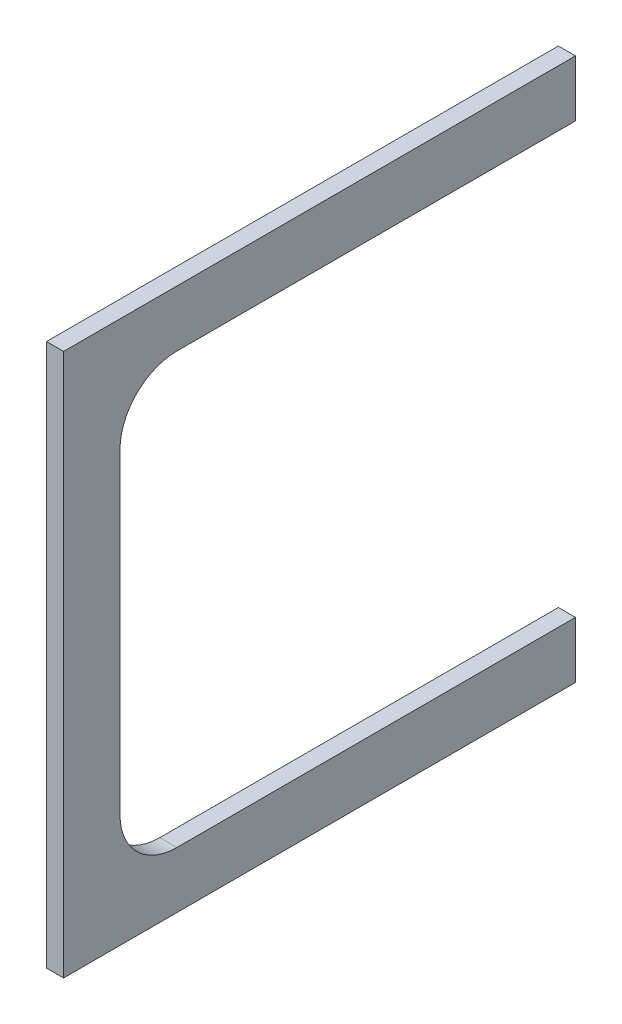
ISO-10303-21;
HEADER;
FILE_DESCRIPTION(('STEP AP214'),'2;1');
FILE_NAME('part.step','',(''),(''),'','','');
FILE_SCHEMA(('AUTOMOTIVE_DESIGN { 1 0 10303 214 1 1 1 1 }'));
ENDSEC;
DATA;
#1=APPLICATION_CONTEXT('core data for automotive mechanical design processes');
#2=APPLICATION_PROTOCOL_DEFINITION('international standard','automotive_design',2000,#1);
#3=PRODUCT_CONTEXT('',#1,'mechanical');
#4=PRODUCT('Part','Part','',(#3));
#5=PRODUCT_RELATED_PRODUCT_CATEGORY('part','',(#4));
#6=PRODUCT_DEFINITION_FORMATION('','',#4);
#7=PRODUCT_DEFINITION_CONTEXT('part definition',#1,'design');
#8=PRODUCT_DEFINITION('design','',#6,#7);
#9=PRODUCT_DEFINITION_SHAPE('','',#8);
#10=(LENGTH_UNIT() NAMED_UNIT(*) SI_UNIT(.MILLI.,.METRE.));
#11=(NAMED_UNIT(*) PLANE_ANGLE_UNIT() SI_UNIT($,.RADIAN.));
#12=(NAMED_UNIT(*) SI_UNIT($,.STERADIAN.) SOLID_ANGLE_UNIT());
#13=UNCERTAINTY_MEASURE_WITH_UNIT(LENGTH_MEASURE(1.E-05),#10,'distance_accuracy_value','');
#14=(GEOMETRIC_REPRESENTATION_CONTEXT(3) GLOBAL_UNCERTAINTY_ASSIGNED_CONTEXT((#13)) GLOBAL_UNIT_ASSIGNED_CONTEXT((#10,
#11,#12)) REPRESENTATION_CONTEXT('',''));
#15=CARTESIAN_POINT('',(0.,0.,0.));
#16=DIRECTION('',(0.,0.,1.));
#17=DIRECTION('',(1.,0.,0.));
#18=AXIS2_PLACEMENT_3D('',#15,#16,#17);
#19=CARTESIAN_POINT('',(1.5,246.9,-36.5));
#20=DIRECTION('',(0.,0.,-1.));
#21=DIRECTION('',(-1.,0.,0.));
#22=AXIS2_PLACEMENT_3D('',#19,#20,#21);
#23=PLANE('',#22);
#24=DIRECTION('',(0.,-1.,0.));
#25=VECTOR('',#24,1.);
#26=CARTESIAN_POINT('',(-1.5,246.9,-36.5));
#27=LINE('',#26,#25);
#28=CARTESIAN_POINT('',(-1.5,246.9,-36.5));
#29=VERTEX_POINT('',#28);
#30=CARTESIAN_POINT('',(-1.5,237.,-36.5));
#31=VERTEX_POINT('',#30);
#32=EDGE_CURVE('E145',#29,#31,#27,.T.);
#33=ORIENTED_EDGE('',*,*,#32,.F.);
#34=DIRECTION('',(-1.,0.,0.));
#35=VECTOR('',#34,1.);
#36=CARTESIAN_POINT('',(1.5,246.9,-36.5));
#37=LINE('',#36,#35);
#38=CARTESIAN_POINT('',(1.5,246.9,-36.5));
#39=VERTEX_POINT('',#38);
#40=EDGE_CURVE('E11',#39,#29,#37,.T.);
#41=ORIENTED_EDGE('',*,*,#40,.F.);
#42=DIRECTION('',(0.,-1.,0.));
#43=VECTOR('',#42,1.);
#44=CARTESIAN_POINT('',(1.5,246.9,-36.5));
#45=LINE('',#44,#43);
#46=CARTESIAN_POINT('',(1.5,237.,-36.5));
#47=VERTEX_POINT('',#46);
#48=EDGE_CURVE('E171',#39,#47,#45,.T.);
#49=ORIENTED_EDGE('',*,*,#48,.T.);
#50=DIRECTION('',(-1.,0.,0.));
#51=VECTOR('',#50,1.);
#52=CARTESIAN_POINT('',(1.5,237.,-36.5));
#53=LINE('',#52,#51);
#54=EDGE_CURVE('E39',#47,#31,#53,.T.);
#55=ORIENTED_EDGE('',*,*,#54,.T.);
#56=EDGE_LOOP('',(#33,#41,#49,#55));
#57=FACE_BOUND('',#56,.T.);
#58=ADVANCED_FACE('F36',(#57),#23,.T.);
#59=CARTESIAN_POINT('',(1.5,246.9,53.4));
#60=DIRECTION('',(0.,1.,0.));
#61=DIRECTION('',(0.,0.,1.));
#62=AXIS2_PLACEMENT_3D('',#59,#60,#61);
#63=PLANE('',#62);
#64=DIRECTION('',(0.,0.,-1.));
#65=VECTOR('',#64,1.);
#66=CARTESIAN_POINT('',(-1.5,246.9,53.4));
#67=LINE('',#66,#65);
#68=CARTESIAN_POINT('',(-1.5,246.9,53.4));
#69=VERTEX_POINT('',#68);
#70=EDGE_CURVE('E169',#69,#29,#67,.T.);
#71=ORIENTED_EDGE('',*,*,#70,.F.);
#72=DIRECTION('',(-1.,0.,0.));
#73=VECTOR('',#72,1.);
#74=CARTESIAN_POINT('',(1.5,246.9,53.4));
#75=LINE('',#74,#73);
#76=CARTESIAN_POINT('',(1.5,246.9,53.4));
#77=VERTEX_POINT('',#76);
#78=EDGE_CURVE('E45',#77,#69,#75,.T.);
#79=ORIENTED_EDGE('',*,*,#78,.F.);
#80=DIRECTION('',(0.,0.,-1.));
#81=VECTOR('',#80,1.);
#82=CARTESIAN_POINT('',(1.5,246.9,53.4));
#83=LINE('',#82,#81);
#84=EDGE_CURVE('E135',#77,#39,#83,.T.);
#85=ORIENTED_EDGE('',*,*,#84,.T.);
#86=ORIENTED_EDGE('',*,*,#40,.T.);
#87=EDGE_LOOP('',(#71,#79,#85,#86));
#88=FACE_BOUND('',#87,.T.);
#89=ADVANCED_FACE('F187',(#88),#63,.T.);
#90=CARTESIAN_POINT('',(1.5,151.6,53.4));
#91=DIRECTION('',(0.,0.,1.));
#92=DIRECTION('',(1.,0.,0.));
#93=AXIS2_PLACEMENT_3D('',#90,#91,#92);
#94=PLANE('',#93);
#95=DIRECTION('',(0.,1.,0.));
#96=VECTOR('',#95,1.);
#97=CARTESIAN_POINT('',(-1.5,151.6,53.4));
#98=LINE('',#97,#96);
#99=CARTESIAN_POINT('',(-1.5,151.6,53.4));
#100=VERTEX_POINT('',#99);
#101=EDGE_CURVE('E122',#100,#69,#98,.T.);
#102=ORIENTED_EDGE('',*,*,#101,.F.);
#103=DIRECTION('',(-1.,0.,0.));
#104=VECTOR('',#103,1.);
#105=CARTESIAN_POINT('',(1.5,151.6,53.4));
#106=LINE('',#105,#104);
#107=CARTESIAN_POINT('',(1.5,151.6,53.4));
#108=VERTEX_POINT('',#107);
#109=EDGE_CURVE('E117',#108,#100,#106,.T.);
#110=ORIENTED_EDGE('',*,*,#109,.F.);
#111=DIRECTION('',(0.,1.,0.));
#112=VECTOR('',#111,1.);
#113=CARTESIAN_POINT('',(1.5,151.6,53.4));
#114=LINE('',#113,#112);
#115=EDGE_CURVE('E120',#108,#77,#114,.T.);
#116=ORIENTED_EDGE('',*,*,#115,.T.);
#117=ORIENTED_EDGE('',*,*,#78,.T.);
#118=EDGE_LOOP('',(#102,#110,#116,#117));
#119=FACE_BOUND('',#118,.T.);
#120=ADVANCED_FACE('F119',(#119),#94,.T.);
#121=CARTESIAN_POINT('',(1.5,151.6,-36.5));
#122=DIRECTION('',(0.,-1.,0.));
#123=DIRECTION('',(0.,0.,-1.));
#124=AXIS2_PLACEMENT_3D('',#121,#122,#123);
#125=PLANE('',#124);
#126=DIRECTION('',(0.,0.,1.));
#127=VECTOR('',#126,1.);
#128=CARTESIAN_POINT('',(-1.5,151.6,-36.5));
#129=LINE('',#128,#127);
#130=CARTESIAN_POINT('',(-1.5,151.6,-36.5));
#131=VERTEX_POINT('',#130);
#132=EDGE_CURVE('E166',#131,#100,#129,.T.);
#133=ORIENTED_EDGE('',*,*,#132,.F.);
#134=DIRECTION('',(-1.,0.,0.));
#135=VECTOR('',#134,1.);
#136=CARTESIAN_POINT('',(1.5,151.6,-36.5));
#137=LINE('',#136,#135);
#138=CARTESIAN_POINT('',(1.5,151.6,-36.5));
#139=VERTEX_POINT('',#138);
#140=EDGE_CURVE('E127',#139,#131,#137,.T.);
#141=ORIENTED_EDGE('',*,*,#140,.F.);
#142=DIRECTION('',(0.,0.,1.));
#143=VECTOR('',#142,1.);
#144=CARTESIAN_POINT('',(1.5,151.6,-36.5));
#145=LINE('',#144,#143);
#146=EDGE_CURVE('E133',#139,#108,#145,.T.);
#147=ORIENTED_EDGE('',*,*,#146,.T.);
#148=ORIENTED_EDGE('',*,*,#109,.T.);
#149=EDGE_LOOP('',(#133,#141,#147,#148));
#150=FACE_BOUND('',#149,.T.);
#151=ADVANCED_FACE('F137',(#150),#125,.T.);
#152=CARTESIAN_POINT('',(1.5,161.5,-36.5));
#153=DIRECTION('',(0.,0.,-1.));
#154=DIRECTION('',(-1.,0.,0.));
#155=AXIS2_PLACEMENT_3D('',#152,#153,#154);
#156=PLANE('',#155);
#157=DIRECTION('',(0.,-1.,0.));
#158=VECTOR('',#157,1.);
#159=CARTESIAN_POINT('',(-1.5,161.5,-36.5));
#160=LINE('',#159,#158);
#161=CARTESIAN_POINT('',(-1.5,161.5,-36.5));
#162=VERTEX_POINT('',#161);
#163=EDGE_CURVE('E163',#162,#131,#160,.T.);
#164=ORIENTED_EDGE('',*,*,#163,.F.);
#165=DIRECTION('',(-1.,0.,0.));
#166=VECTOR('',#165,1.);
#167=CARTESIAN_POINT('',(1.5,161.5,-36.5));
#168=LINE('',#167,#166);
#169=CARTESIAN_POINT('',(1.5,161.5,-36.5));
#170=VERTEX_POINT('',#169);
#171=EDGE_CURVE('E175',#170,#162,#168,.T.);
#172=ORIENTED_EDGE('',*,*,#171,.F.);
#173=DIRECTION('',(0.,-1.,0.));
#174=VECTOR('',#173,1.);
#175=CARTESIAN_POINT('',(1.5,161.5,-36.5));
#176=LINE('',#175,#174);
#177=EDGE_CURVE('E138',#170,#139,#176,.T.);
#178=ORIENTED_EDGE('',*,*,#177,.T.);
#179=ORIENTED_EDGE('',*,*,#140,.T.);
#180=EDGE_LOOP('',(#164,#172,#178,#179));
#181=FACE_BOUND('',#180,.T.);
#182=ADVANCED_FACE('F200',(#181),#156,.T.);
#183=CARTESIAN_POINT('',(1.5,161.5,33.5));
#184=DIRECTION('',(0.,1.,0.));
#185=DIRECTION('',(0.,0.,1.));
#186=AXIS2_PLACEMENT_3D('',#183,#184,#185);
#187=PLANE('',#186);
#188=DIRECTION('',(0.,0.,-1.));
#189=VECTOR('',#188,1.);
#190=CARTESIAN_POINT('',(-1.5,161.5,33.5));
#191=LINE('',#190,#189);
#192=CARTESIAN_POINT('',(-1.5,161.5,33.5));
#193=VERTEX_POINT('',#192);
#194=EDGE_CURVE('E160',#193,#162,#191,.T.);
#195=ORIENTED_EDGE('',*,*,#194,.F.);
#196=DIRECTION('',(-1.,0.,0.));
#197=VECTOR('',#196,1.);
#198=CARTESIAN_POINT('',(1.5,161.5,33.5));
#199=LINE('',#198,#197);
#200=CARTESIAN_POINT('',(1.5,161.5,33.5));
#201=VERTEX_POINT('',#200);
#202=EDGE_CURVE('E177',#201,#193,#199,.T.);
#203=ORIENTED_EDGE('',*,*,#202,.F.);
#204=DIRECTION('',(0.,0.,-1.));
#205=VECTOR('',#204,1.);
#206=CARTESIAN_POINT('',(1.5,161.5,33.5));
#207=LINE('',#206,#205);
#208=EDGE_CURVE('E140',#201,#170,#207,.T.);
#209=ORIENTED_EDGE('',*,*,#208,.T.);
#210=ORIENTED_EDGE('',*,*,#171,.T.);
#211=EDGE_LOOP('',(#195,#203,#209,#210));
#212=FACE_BOUND('',#211,.T.);
#213=ADVANCED_FACE('F203',(#212),#187,.T.);
#214=CARTESIAN_POINT('',(1.5,171.5,33.5));
#215=DIRECTION('',(-1.,0.,0.));
#216=DIRECTION('',(0.,0.,1.));
#217=AXIS2_PLACEMENT_3D('',#214,#215,#216);
#218=CYLINDRICAL_SURFACE('',#217,10.);
#219=CARTESIAN_POINT('',(-1.5,171.5,33.5));
#220=DIRECTION('',(1.,0.,0.));
#221=DIRECTION('',(0.,0.,-1.));
#222=AXIS2_PLACEMENT_3D('',#219,#220,#221);
#223=CIRCLE('',#222,10.);
#224=CARTESIAN_POINT('',(-1.5,171.5,43.5));
#225=VERTEX_POINT('',#224);
#226=EDGE_CURVE('E157',#225,#193,#223,.T.);
#227=ORIENTED_EDGE('',*,*,#226,.F.);
#228=DIRECTION('',(-1.,0.,0.));
#229=VECTOR('',#228,1.);
#230=CARTESIAN_POINT('',(1.5,171.5,43.5));
#231=LINE('',#230,#229);
#232=CARTESIAN_POINT('',(1.5,171.5,43.5));
#233=VERTEX_POINT('',#232);
#234=EDGE_CURVE('E179',#233,#225,#231,.T.);
#235=ORIENTED_EDGE('',*,*,#234,.F.);
#236=CARTESIAN_POINT('',(1.5,171.5,33.5));
#237=DIRECTION('',(1.,0.,0.));
#238=DIRECTION('',(0.,0.,-1.));
#239=AXIS2_PLACEMENT_3D('',#236,#237,#238);
#240=CIRCLE('',#239,10.);
#241=EDGE_CURVE('E326',#233,#201,#240,.T.);
#242=ORIENTED_EDGE('',*,*,#241,.T.);
#243=ORIENTED_EDGE('',*,*,#202,.T.);
#244=EDGE_LOOP('',(#227,#235,#242,#243));
#245=FACE_BOUND('',#244,.T.);
#246=ADVANCED_FACE('F207',(#245),#218,.F.);
#247=CARTESIAN_POINT('',(1.5,227.,43.5));
#248=DIRECTION('',(0.,0.,-1.));
#249=DIRECTION('',(-1.,0.,0.));
#250=AXIS2_PLACEMENT_3D('',#247,#248,#249);
#251=PLANE('',#250);
#252=DIRECTION('',(0.,-1.,0.));
#253=VECTOR('',#252,1.);
#254=CARTESIAN_POINT('',(-1.5,227.,43.5));
#255=LINE('',#254,#253);
#256=CARTESIAN_POINT('',(-1.5,227.,43.5));
#257=VERTEX_POINT('',#256);
#258=EDGE_CURVE('E154',#257,#225,#255,.T.);
#259=ORIENTED_EDGE('',*,*,#258,.F.);
#260=DIRECTION('',(-1.,0.,0.));
#261=VECTOR('',#260,1.);
#262=CARTESIAN_POINT('',(1.5,227.,43.5));
#263=LINE('',#262,#261);
#264=CARTESIAN_POINT('',(1.5,227.,43.5));
#265=VERTEX_POINT('',#264);
#266=EDGE_CURVE('E181',#265,#257,#263,.T.);
#267=ORIENTED_EDGE('',*,*,#266,.F.);
#268=DIRECTION('',(0.,-1.,0.));
#269=VECTOR('',#268,1.);
#270=CARTESIAN_POINT('',(1.5,227.,43.5));
#271=LINE('',#270,#269);
#272=EDGE_CURVE('E322',#265,#233,#271,.T.);
#273=ORIENTED_EDGE('',*,*,#272,.T.);
#274=ORIENTED_EDGE('',*,*,#234,.T.);
#275=EDGE_LOOP('',(#259,#267,#273,#274));
#276=FACE_BOUND('',#275,.T.);
#277=ADVANCED_FACE('F211',(#276),#251,.T.);
#278=CARTESIAN_POINT('',(1.5,227.,33.5));
#279=DIRECTION('',(-1.,0.,0.));
#280=DIRECTION('',(0.,0.,1.));
#281=AXIS2_PLACEMENT_3D('',#278,#279,#280);
#282=CYLINDRICAL_SURFACE('',#281,9.99999999999999);
#283=CARTESIAN_POINT('',(-1.5,227.,33.5));
#284=DIRECTION('',(1.,0.,0.));
#285=DIRECTION('',(0.,0.,-1.));
#286=AXIS2_PLACEMENT_3D('',#283,#284,#285);
#287=CIRCLE('',#286,9.99999999999999);
#288=CARTESIAN_POINT('',(-1.5,237.,33.5));
#289=VERTEX_POINT('',#288);
#290=EDGE_CURVE('E151',#289,#257,#287,.T.);
#291=ORIENTED_EDGE('',*,*,#290,.F.);
#292=DIRECTION('',(-1.,0.,0.));
#293=VECTOR('',#292,1.);
#294=CARTESIAN_POINT('',(1.5,237.,33.5));
#295=LINE('',#294,#293);
#296=CARTESIAN_POINT('',(1.5,237.,33.5));
#297=VERTEX_POINT('',#296);
#298=EDGE_CURVE('E182',#297,#289,#295,.T.);
#299=ORIENTED_EDGE('',*,*,#298,.F.);
#300=CARTESIAN_POINT('',(1.5,227.,33.5));
#301=DIRECTION('',(1.,0.,0.));
#302=DIRECTION('',(0.,0.,-1.));
#303=AXIS2_PLACEMENT_3D('',#300,#301,#302);
#304=CIRCLE('',#303,9.99999999999999);
#305=EDGE_CURVE('E333',#297,#265,#304,.T.);
#306=ORIENTED_EDGE('',*,*,#305,.T.);
#307=ORIENTED_EDGE('',*,*,#266,.T.);
#308=EDGE_LOOP('',(#291,#299,#306,#307));
#309=FACE_BOUND('',#308,.T.);
#310=ADVANCED_FACE('F215',(#309),#282,.F.);
#311=CARTESIAN_POINT('',(1.5,237.,-36.5));
#312=DIRECTION('',(0.,-1.,0.));
#313=DIRECTION('',(0.,0.,-1.));
#314=AXIS2_PLACEMENT_3D('',#311,#312,#313);
#315=PLANE('',#314);
#316=DIRECTION('',(0.,0.,1.));
#317=VECTOR('',#316,1.);
#318=CARTESIAN_POINT('',(-1.5,237.,-36.5));
#319=LINE('',#318,#317);
#320=EDGE_CURVE('E148',#31,#289,#319,.T.);
#321=ORIENTED_EDGE('',*,*,#320,.F.);
#322=ORIENTED_EDGE('',*,*,#54,.F.);
#323=DIRECTION('',(0.,0.,1.));
#324=VECTOR('',#323,1.);
#325=CARTESIAN_POINT('',(1.5,237.,-36.5));
#326=LINE('',#325,#324);
#327=EDGE_CURVE('E335',#47,#297,#326,.T.);
#328=ORIENTED_EDGE('',*,*,#327,.T.);
#329=ORIENTED_EDGE('',*,*,#298,.T.);
#330=EDGE_LOOP('',(#321,#322,#328,#329));
#331=FACE_BOUND('',#330,.T.);
#332=ADVANCED_FACE('F184',(#331),#315,.T.);
#333=CARTESIAN_POINT('',(1.5,227.,33.5));
#334=DIRECTION('',(1.,0.,0.));
#335=DIRECTION('',(0.,0.,-1.));
#336=AXIS2_PLACEMENT_3D('',#333,#334,#335);
#337=PLANE('',#336);
#338=ORIENTED_EDGE('',*,*,#48,.F.);
#339=ORIENTED_EDGE('',*,*,#84,.F.);
#340=ORIENTED_EDGE('',*,*,#115,.F.);
#341=ORIENTED_EDGE('',*,*,#146,.F.);
#342=ORIENTED_EDGE('',*,*,#177,.F.);
#343=ORIENTED_EDGE('',*,*,#208,.F.);
#344=ORIENTED_EDGE('',*,*,#241,.F.);
#345=ORIENTED_EDGE('',*,*,#272,.F.);
#346=ORIENTED_EDGE('',*,*,#305,.F.);
#347=ORIENTED_EDGE('',*,*,#327,.F.);
#348=EDGE_LOOP('',(#338,#339,#340,#341,#342,#343,#344,#345,#346,#347));
#349=FACE_BOUND('',#348,.T.);
#350=ADVANCED_FACE('F131',(#349),#337,.T.);
#351=CARTESIAN_POINT('',(-1.5,227.,33.5));
#352=DIRECTION('',(1.,0.,0.));
#353=DIRECTION('',(0.,0.,-1.));
#354=AXIS2_PLACEMENT_3D('',#351,#352,#353);
#355=PLANE('',#354);
#356=ORIENTED_EDGE('',*,*,#32,.T.);
#357=ORIENTED_EDGE('',*,*,#320,.T.);
#358=ORIENTED_EDGE('',*,*,#290,.T.);
#359=ORIENTED_EDGE('',*,*,#258,.T.);
#360=ORIENTED_EDGE('',*,*,#226,.T.);
#361=ORIENTED_EDGE('',*,*,#194,.T.);
#362=ORIENTED_EDGE('',*,*,#163,.T.);
#363=ORIENTED_EDGE('',*,*,#132,.T.);
#364=ORIENTED_EDGE('',*,*,#101,.T.);
#365=ORIENTED_EDGE('',*,*,#70,.T.);
#366=EDGE_LOOP('',(#356,#357,#358,#359,#360,#361,#362,#363,#364,#365));
#367=FACE_BOUND('',#366,.T.);
#368=ADVANCED_FACE('F186',(#367),#355,.F.);
#369=CLOSED_SHELL('',(#58,#89,#120,#151,#182,#213,#246,#277,#310,#332,#350,#368));
#370=MANIFOLD_SOLID_BREP('B2',#369);
#371=ADVANCED_BREP_SHAPE_REPRESENTATION('',(#18,#370),#14);
#372=SHAPE_DEFINITION_REPRESENTATION(#9,#371);
ENDSEC;
END-ISO-10303-21;
